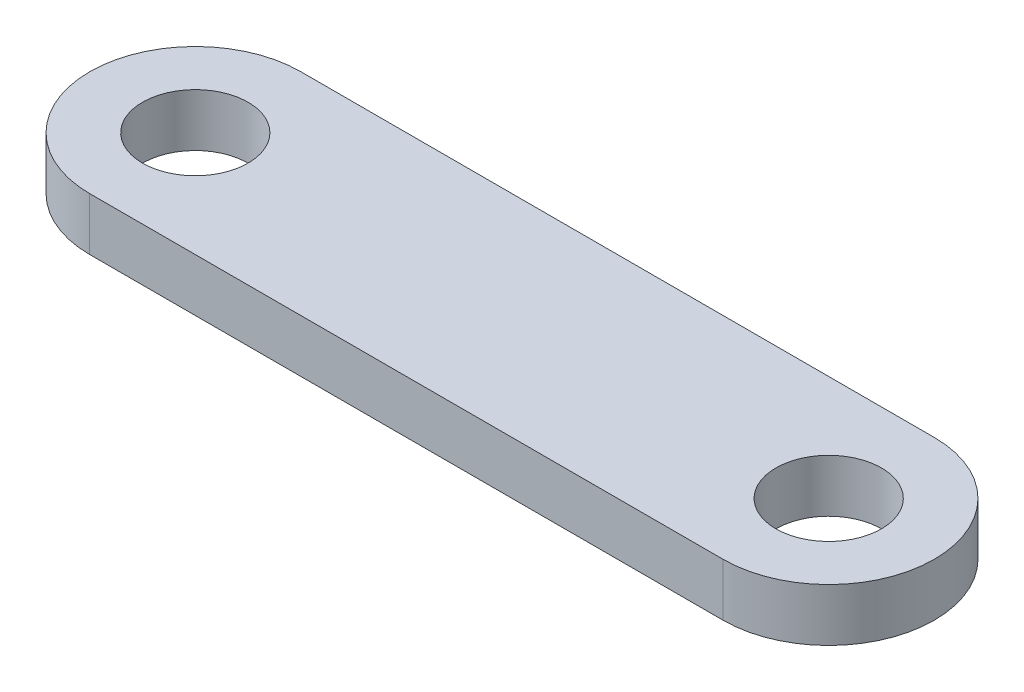
ISO-10303-21;
HEADER;
FILE_DESCRIPTION(('STEP AP214'),'2;1');
FILE_NAME('part.step','',(''),(''),'','','');
FILE_SCHEMA(('AUTOMOTIVE_DESIGN { 1 0 10303 214 1 1 1 1 }'));
ENDSEC;
DATA;
#1=APPLICATION_CONTEXT('core data for automotive mechanical design processes');
#2=APPLICATION_PROTOCOL_DEFINITION('international standard','automotive_design',2000,#1);
#3=PRODUCT_CONTEXT('',#1,'mechanical');
#4=PRODUCT('Part','Part','',(#3));
#5=PRODUCT_RELATED_PRODUCT_CATEGORY('part','',(#4));
#6=PRODUCT_DEFINITION_FORMATION('','',#4);
#7=PRODUCT_DEFINITION_CONTEXT('part definition',#1,'design');
#8=PRODUCT_DEFINITION('design','',#6,#7);
#9=PRODUCT_DEFINITION_SHAPE('','',#8);
#10=(LENGTH_UNIT() NAMED_UNIT(*) SI_UNIT(.MILLI.,.METRE.));
#11=(NAMED_UNIT(*) PLANE_ANGLE_UNIT() SI_UNIT($,.RADIAN.));
#12=(NAMED_UNIT(*) SI_UNIT($,.STERADIAN.) SOLID_ANGLE_UNIT());
#13=UNCERTAINTY_MEASURE_WITH_UNIT(LENGTH_MEASURE(1.E-05),#10,'distance_accuracy_value','');
#14=(GEOMETRIC_REPRESENTATION_CONTEXT(3) GLOBAL_UNCERTAINTY_ASSIGNED_CONTEXT((#13)) GLOBAL_UNIT_ASSIGNED_CONTEXT((#10,
#11,#12)) REPRESENTATION_CONTEXT('',''));
#15=CARTESIAN_POINT('',(0.,0.,0.));
#16=DIRECTION('',(0.,0.,1.));
#17=DIRECTION('',(1.,0.,0.));
#18=AXIS2_PLACEMENT_3D('',#15,#16,#17);
#19=CARTESIAN_POINT('',(-51.2230215827338,5.,-6.90647482014389));
#20=DIRECTION('',(0.,1.,0.));
#21=DIRECTION('',(0.,0.,1.));
#22=AXIS2_PLACEMENT_3D('',#19,#20,#21);
#23=PLANE('',#22);
#24=CARTESIAN_POINT('',(-51.2230215827338,5.,-6.90647482014389));
#25=DIRECTION('',(0.,1.,0.));
#26=DIRECTION('',(0.,0.,1.));
#27=AXIS2_PLACEMENT_3D('',#24,#25,#26);
#28=CIRCLE('',#27,5.);
#29=CARTESIAN_POINT('',(-51.2230215827338,5.,-1.90647482014389));
#30=VERTEX_POINT('',#29);
#31=EDGE_CURVE('E107',#30,#30,#28,.T.);
#32=ORIENTED_EDGE('',*,*,#31,.F.);
#33=EDGE_LOOP('',(#32));
#34=FACE_BOUND('',#33,.T.);
#35=CARTESIAN_POINT('',(-51.2230215827338,5.,-6.90647482014389));
#36=DIRECTION('',(0.,1.,0.));
#37=DIRECTION('',(0.,0.,1.));
#38=AXIS2_PLACEMENT_3D('',#35,#36,#37);
#39=CIRCLE('',#38,10.);
#40=CARTESIAN_POINT('',(-51.2230215827338,5.,-16.9064748201439));
#41=VERTEX_POINT('',#40);
#42=CARTESIAN_POINT('',(-51.2230215827338,5.,3.09352517985611));
#43=VERTEX_POINT('',#42);
#44=EDGE_CURVE('E92',#41,#43,#39,.T.);
#45=ORIENTED_EDGE('',*,*,#44,.T.);
#46=DIRECTION('',(1.,0.,0.));
#47=VECTOR('',#46,1.);
#48=CARTESIAN_POINT('',(-51.2230215827338,5.,3.09352517985611));
#49=LINE('',#48,#47);
#50=CARTESIAN_POINT('',(8.77697841726619,5.,3.09352517985611));
#51=VERTEX_POINT('',#50);
#52=EDGE_CURVE('E87',#43,#51,#49,.T.);
#53=ORIENTED_EDGE('',*,*,#52,.T.);
#54=CARTESIAN_POINT('',(8.77697841726619,5.,-6.90647482014388));
#55=DIRECTION('',(0.,1.,0.));
#56=DIRECTION('',(0.,0.,1.));
#57=AXIS2_PLACEMENT_3D('',#54,#55,#56);
#58=CIRCLE('',#57,10.);
#59=CARTESIAN_POINT('',(8.77697841726619,5.,-16.9064748201439));
#60=VERTEX_POINT('',#59);
#61=EDGE_CURVE('E90',#51,#60,#58,.T.);
#62=ORIENTED_EDGE('',*,*,#61,.T.);
#63=DIRECTION('',(-1.,0.,0.));
#64=VECTOR('',#63,1.);
#65=CARTESIAN_POINT('',(-51.2230215827338,5.,-16.9064748201439));
#66=LINE('',#65,#64);
#67=EDGE_CURVE('E57',#60,#41,#66,.T.);
#68=ORIENTED_EDGE('',*,*,#67,.T.);
#69=EDGE_LOOP('',(#45,#53,#62,#68));
#70=FACE_BOUND('',#69,.T.);
#71=CARTESIAN_POINT('',(8.77697841726619,5.,-6.90647482014388));
#72=DIRECTION('',(0.,1.,0.));
#73=DIRECTION('',(0.,0.,1.));
#74=AXIS2_PLACEMENT_3D('',#71,#72,#73);
#75=CIRCLE('',#74,5.);
#76=CARTESIAN_POINT('',(8.77697841726619,5.,-1.90647482014389));
#77=VERTEX_POINT('',#76);
#78=EDGE_CURVE('E122',#77,#77,#75,.T.);
#79=ORIENTED_EDGE('',*,*,#78,.F.);
#80=EDGE_LOOP('',(#79));
#81=FACE_BOUND('',#80,.T.);
#82=ADVANCED_FACE('F40',(#34,#70,#81),#23,.T.);
#83=CARTESIAN_POINT('',(-51.2230215827338,0.,-6.90647482014389));
#84=DIRECTION('',(0.,1.,0.));
#85=DIRECTION('',(0.,0.,1.));
#86=AXIS2_PLACEMENT_3D('',#83,#84,#85);
#87=PLANE('',#86);
#88=CARTESIAN_POINT('',(-51.2230215827338,0.,-6.90647482014389));
#89=DIRECTION('',(0.,1.,0.));
#90=DIRECTION('',(0.,0.,1.));
#91=AXIS2_PLACEMENT_3D('',#88,#89,#90);
#92=CIRCLE('',#91,10.);
#93=CARTESIAN_POINT('',(-51.2230215827338,0.,-16.9064748201439));
#94=VERTEX_POINT('',#93);
#95=CARTESIAN_POINT('',(-51.2230215827338,0.,3.09352517985611));
#96=VERTEX_POINT('',#95);
#97=EDGE_CURVE('E104',#94,#96,#92,.T.);
#98=ORIENTED_EDGE('',*,*,#97,.F.);
#99=DIRECTION('',(-1.,0.,0.));
#100=VECTOR('',#99,1.);
#101=CARTESIAN_POINT('',(-51.2230215827338,0.,-16.9064748201439));
#102=LINE('',#101,#100);
#103=CARTESIAN_POINT('',(8.77697841726619,0.,-16.9064748201439));
#104=VERTEX_POINT('',#103);
#105=EDGE_CURVE('E80',#104,#94,#102,.T.);
#106=ORIENTED_EDGE('',*,*,#105,.F.);
#107=CARTESIAN_POINT('',(8.77697841726619,0.,-6.90647482014388));
#108=DIRECTION('',(0.,1.,0.));
#109=DIRECTION('',(0.,0.,1.));
#110=AXIS2_PLACEMENT_3D('',#107,#108,#109);
#111=CIRCLE('',#110,10.);
#112=CARTESIAN_POINT('',(8.77697841726619,0.,3.09352517985611));
#113=VERTEX_POINT('',#112);
#114=EDGE_CURVE('E74',#113,#104,#111,.T.);
#115=ORIENTED_EDGE('',*,*,#114,.F.);
#116=DIRECTION('',(1.,0.,0.));
#117=VECTOR('',#116,1.);
#118=CARTESIAN_POINT('',(-51.2230215827338,0.,3.09352517985611));
#119=LINE('',#118,#117);
#120=EDGE_CURVE('E96',#96,#113,#119,.T.);
#121=ORIENTED_EDGE('',*,*,#120,.F.);
#122=EDGE_LOOP('',(#98,#106,#115,#121));
#123=FACE_BOUND('',#122,.T.);
#124=CARTESIAN_POINT('',(-51.2230215827338,0.,-6.90647482014389));
#125=DIRECTION('',(0.,1.,0.));
#126=DIRECTION('',(0.,0.,1.));
#127=AXIS2_PLACEMENT_3D('',#124,#125,#126);
#128=CIRCLE('',#127,5.);
#129=CARTESIAN_POINT('',(-51.2230215827338,0.,-1.90647482014389));
#130=VERTEX_POINT('',#129);
#131=EDGE_CURVE('E119',#130,#130,#128,.T.);
#132=ORIENTED_EDGE('',*,*,#131,.T.);
#133=EDGE_LOOP('',(#132));
#134=FACE_BOUND('',#133,.T.);
#135=CARTESIAN_POINT('',(8.77697841726619,0.,-6.90647482014388));
#136=DIRECTION('',(0.,1.,0.));
#137=DIRECTION('',(0.,0.,1.));
#138=AXIS2_PLACEMENT_3D('',#135,#136,#137);
#139=CIRCLE('',#138,5.);
#140=CARTESIAN_POINT('',(8.77697841726619,0.,-1.90647482014389));
#141=VERTEX_POINT('',#140);
#142=EDGE_CURVE('E125',#141,#141,#139,.T.);
#143=ORIENTED_EDGE('',*,*,#142,.T.);
#144=EDGE_LOOP('',(#143));
#145=FACE_BOUND('',#144,.T.);
#146=ADVANCED_FACE('F115',(#123,#134,#145),#87,.F.);
#147=CARTESIAN_POINT('',(-51.2230215827338,5.,-6.90647482014389));
#148=DIRECTION('',(0.,-1.,0.));
#149=DIRECTION('',(0.,0.,-1.));
#150=AXIS2_PLACEMENT_3D('',#147,#148,#149);
#151=CYLINDRICAL_SURFACE('',#150,10.);
#152=ORIENTED_EDGE('',*,*,#97,.T.);
#153=DIRECTION('',(0.,-1.,0.));
#154=VECTOR('',#153,1.);
#155=CARTESIAN_POINT('',(-51.2230215827338,5.,3.09352517985611));
#156=LINE('',#155,#154);
#157=EDGE_CURVE('E11',#43,#96,#156,.T.);
#158=ORIENTED_EDGE('',*,*,#157,.F.);
#159=ORIENTED_EDGE('',*,*,#44,.F.);
#160=DIRECTION('',(0.,-1.,0.));
#161=VECTOR('',#160,1.);
#162=CARTESIAN_POINT('',(-51.2230215827338,5.,-16.9064748201439));
#163=LINE('',#162,#161);
#164=EDGE_CURVE('E100',#41,#94,#163,.T.);
#165=ORIENTED_EDGE('',*,*,#164,.T.);
#166=EDGE_LOOP('',(#152,#158,#159,#165));
#167=FACE_BOUND('',#166,.T.);
#168=ADVANCED_FACE('F42',(#167),#151,.T.);
#169=CARTESIAN_POINT('',(-51.2230215827338,5.,3.09352517985611));
#170=DIRECTION('',(0.,0.,-1.));
#171=DIRECTION('',(-1.,0.,0.));
#172=AXIS2_PLACEMENT_3D('',#169,#170,#171);
#173=PLANE('',#172);
#174=ORIENTED_EDGE('',*,*,#120,.T.);
#175=DIRECTION('',(0.,-1.,0.));
#176=VECTOR('',#175,1.);
#177=CARTESIAN_POINT('',(8.77697841726619,5.,3.09352517985611));
#178=LINE('',#177,#176);
#179=EDGE_CURVE('E49',#51,#113,#178,.T.);
#180=ORIENTED_EDGE('',*,*,#179,.F.);
#181=ORIENTED_EDGE('',*,*,#52,.F.);
#182=ORIENTED_EDGE('',*,*,#157,.T.);
#183=EDGE_LOOP('',(#174,#180,#181,#182));
#184=FACE_BOUND('',#183,.T.);
#185=ADVANCED_FACE('F95',(#184),#173,.F.);
#186=CARTESIAN_POINT('',(8.77697841726619,5.,-6.90647482014388));
#187=DIRECTION('',(0.,-1.,0.));
#188=DIRECTION('',(0.,0.,-1.));
#189=AXIS2_PLACEMENT_3D('',#186,#187,#188);
#190=CYLINDRICAL_SURFACE('',#189,10.);
#191=ORIENTED_EDGE('',*,*,#114,.T.);
#192=DIRECTION('',(0.,-1.,0.));
#193=VECTOR('',#192,1.);
#194=CARTESIAN_POINT('',(8.77697841726619,5.,-16.9064748201439));
#195=LINE('',#194,#193);
#196=EDGE_CURVE('E97',#60,#104,#195,.T.);
#197=ORIENTED_EDGE('',*,*,#196,.F.);
#198=ORIENTED_EDGE('',*,*,#61,.F.);
#199=ORIENTED_EDGE('',*,*,#179,.T.);
#200=EDGE_LOOP('',(#191,#197,#198,#199));
#201=FACE_BOUND('',#200,.T.);
#202=ADVANCED_FACE('F98',(#201),#190,.T.);
#203=CARTESIAN_POINT('',(-51.2230215827338,5.,-16.9064748201439));
#204=DIRECTION('',(0.,0.,1.));
#205=DIRECTION('',(1.,0.,0.));
#206=AXIS2_PLACEMENT_3D('',#203,#204,#205);
#207=PLANE('',#206);
#208=ORIENTED_EDGE('',*,*,#105,.T.);
#209=ORIENTED_EDGE('',*,*,#164,.F.);
#210=ORIENTED_EDGE('',*,*,#67,.F.);
#211=ORIENTED_EDGE('',*,*,#196,.T.);
#212=EDGE_LOOP('',(#208,#209,#210,#211));
#213=FACE_BOUND('',#212,.T.);
#214=ADVANCED_FACE('F112',(#213),#207,.F.);
#215=CARTESIAN_POINT('',(-51.2230215827338,5.,-6.90647482014389));
#216=DIRECTION('',(0.,-1.,0.));
#217=DIRECTION('',(0.,0.,-1.));
#218=AXIS2_PLACEMENT_3D('',#215,#216,#217);
#219=CYLINDRICAL_SURFACE('',#218,5.);
#220=ORIENTED_EDGE('',*,*,#31,.T.);
#221=EDGE_LOOP('',(#220));
#222=FACE_BOUND('',#221,.T.);
#223=ORIENTED_EDGE('',*,*,#131,.F.);
#224=EDGE_LOOP('',(#223));
#225=FACE_BOUND('',#224,.T.);
#226=ADVANCED_FACE('F142',(#222,#225),#219,.F.);
#227=CARTESIAN_POINT('',(8.77697841726619,5.,-6.90647482014388));
#228=DIRECTION('',(0.,-1.,0.));
#229=DIRECTION('',(0.,0.,-1.));
#230=AXIS2_PLACEMENT_3D('',#227,#228,#229);
#231=CYLINDRICAL_SURFACE('',#230,5.);
#232=ORIENTED_EDGE('',*,*,#78,.T.);
#233=EDGE_LOOP('',(#232));
#234=FACE_BOUND('',#233,.T.);
#235=ORIENTED_EDGE('',*,*,#142,.F.);
#236=EDGE_LOOP('',(#235));
#237=FACE_BOUND('',#236,.T.);
#238=ADVANCED_FACE('F131',(#234,#237),#231,.F.);
#239=CLOSED_SHELL('',(#82,#146,#168,#185,#202,#214,#226,#238));
#240=MANIFOLD_SOLID_BREP('B2',#239);
#241=ADVANCED_BREP_SHAPE_REPRESENTATION('',(#18,#240),#14);
#242=SHAPE_DEFINITION_REPRESENTATION(#9,#241);
ENDSEC;
END-ISO-10303-21;
